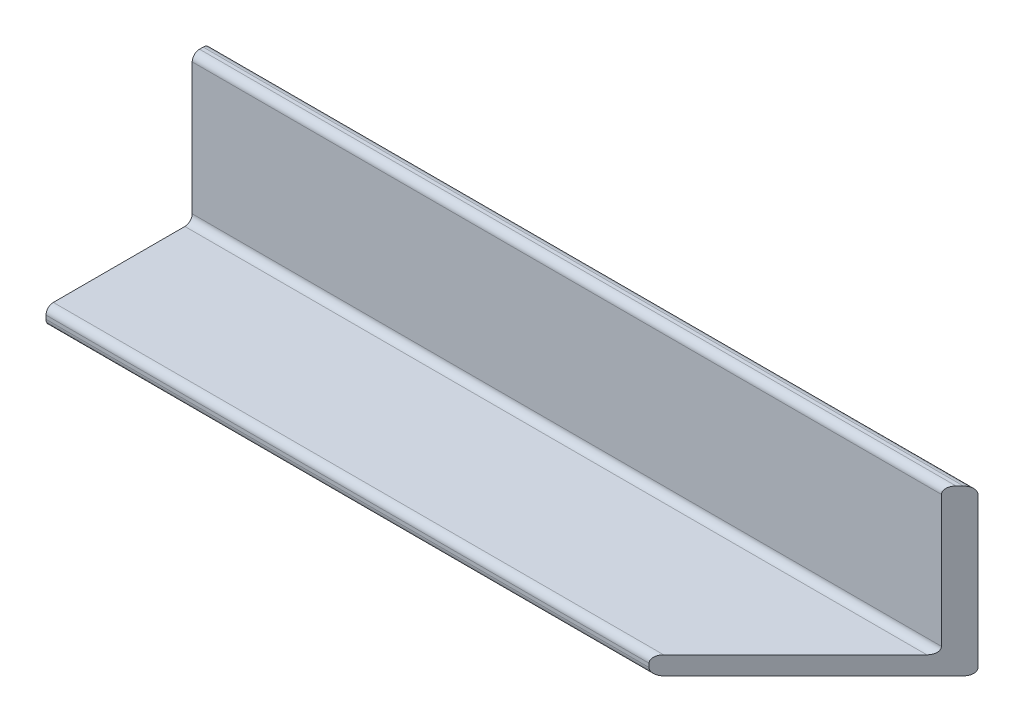
ISO-10303-21;
HEADER;
FILE_DESCRIPTION(('STEP AP214'),'2;1');
FILE_NAME('part.step','',(''),(''),'','','');
FILE_SCHEMA(('AUTOMOTIVE_DESIGN { 1 0 10303 214 1 1 1 1 }'));
ENDSEC;
DATA;
#1=APPLICATION_CONTEXT('core data for automotive mechanical design processes');
#2=APPLICATION_PROTOCOL_DEFINITION('international standard','automotive_design',2000,#1);
#3=PRODUCT_CONTEXT('',#1,'mechanical');
#4=PRODUCT('Part','Part','',(#3));
#5=PRODUCT_RELATED_PRODUCT_CATEGORY('part','',(#4));
#6=PRODUCT_DEFINITION_FORMATION('','',#4);
#7=PRODUCT_DEFINITION_CONTEXT('part definition',#1,'design');
#8=PRODUCT_DEFINITION('design','',#6,#7);
#9=PRODUCT_DEFINITION_SHAPE('','',#8);
#10=(LENGTH_UNIT() NAMED_UNIT(*) SI_UNIT(.MILLI.,.METRE.));
#11=(NAMED_UNIT(*) PLANE_ANGLE_UNIT() SI_UNIT($,.RADIAN.));
#12=(NAMED_UNIT(*) SI_UNIT($,.STERADIAN.) SOLID_ANGLE_UNIT());
#13=UNCERTAINTY_MEASURE_WITH_UNIT(LENGTH_MEASURE(1.E-05),#10,'distance_accuracy_value','');
#14=(GEOMETRIC_REPRESENTATION_CONTEXT(3) GLOBAL_UNCERTAINTY_ASSIGNED_CONTEXT((#13)) GLOBAL_UNIT_ASSIGNED_CONTEXT((#10,
#11,#12)) REPRESENTATION_CONTEXT('',''));
#15=CARTESIAN_POINT('',(0.,0.,0.));
#16=DIRECTION('',(0.,0.,1.));
#17=DIRECTION('',(1.,0.,0.));
#18=AXIS2_PLACEMENT_3D('',#15,#16,#17);
#19=CARTESIAN_POINT('',(-52.5,2.5,-11.25));
#20=DIRECTION('',(0.,0.,1.));
#21=DIRECTION('',(1.,0.,0.));
#22=AXIS2_PLACEMENT_3D('',#19,#20,#21);
#23=PLANE('',#22);
#24=DIRECTION('',(0.,-1.,0.));
#25=VECTOR('',#24,1.);
#26=CARTESIAN_POINT('',(-52.5,2.5,-11.25));
#27=LINE('',#26,#25);
#28=CARTESIAN_POINT('',(-52.5,21.5,-11.25));
#29=VERTEX_POINT('',#28);
#30=CARTESIAN_POINT('',(-52.5,1.,-11.25));
#31=VERTEX_POINT('',#30);
#32=EDGE_CURVE('E215',#29,#31,#27,.T.);
#33=ORIENTED_EDGE('',*,*,#32,.F.);
#34=DIRECTION('',(-1.,0.,0.));
#35=VECTOR('',#34,1.);
#36=CARTESIAN_POINT('',(52.5,21.5,-11.25));
#37=LINE('',#36,#35);
#38=CARTESIAN_POINT('',(52.5,21.5,-11.25));
#39=VERTEX_POINT('',#38);
#40=EDGE_CURVE('E158',#29,#39,#37,.F.);
#41=ORIENTED_EDGE('',*,*,#40,.T.);
#42=DIRECTION('',(0.,-1.,0.));
#43=VECTOR('',#42,1.);
#44=CARTESIAN_POINT('',(52.5,2.5,-11.25));
#45=LINE('',#44,#43);
#46=CARTESIAN_POINT('',(52.5,1.,-11.25));
#47=VERTEX_POINT('',#46);
#48=EDGE_CURVE('E125',#39,#47,#45,.T.);
#49=ORIENTED_EDGE('',*,*,#48,.T.);
#50=DIRECTION('',(-1.,0.,0.));
#51=VECTOR('',#50,1.);
#52=CARTESIAN_POINT('',(-52.5,1.,-11.25));
#53=LINE('',#52,#51);
#54=EDGE_CURVE('E155',#47,#31,#53,.T.);
#55=ORIENTED_EDGE('',*,*,#54,.T.);
#56=EDGE_LOOP('',(#33,#41,#49,#55));
#57=FACE_BOUND('',#56,.T.);
#58=ADVANCED_FACE('F32',(#57),#23,.F.);
#59=CARTESIAN_POINT('',(-52.5,2.5,-11.25));
#60=DIRECTION('',(1.,0.,0.));
#61=DIRECTION('',(0.,0.,-1.));
#62=AXIS2_PLACEMENT_3D('',#59,#60,#61);
#63=PLANE('',#62);
#64=DIRECTION('',(0.,0.,1.));
#65=VECTOR('',#64,1.);
#66=CARTESIAN_POINT('',(-52.5,22.5,-11.25));
#67=LINE('',#66,#65);
#68=CARTESIAN_POINT('',(-52.5,22.5,-10.25));
#69=VERTEX_POINT('',#68);
#70=CARTESIAN_POINT('',(-52.5,22.5,-9.75));
#71=VERTEX_POINT('',#70);
#72=EDGE_CURVE('E192',#69,#71,#67,.T.);
#73=ORIENTED_EDGE('',*,*,#72,.F.);
#74=CARTESIAN_POINT('',(-52.5,21.5,-10.25));
#75=DIRECTION('',(1.,0.,0.));
#76=DIRECTION('',(0.,0.,-1.));
#77=AXIS2_PLACEMENT_3D('',#74,#75,#76);
#78=CIRCLE('',#77,1.);
#79=EDGE_CURVE('E142',#69,#29,#78,.F.);
#80=ORIENTED_EDGE('',*,*,#79,.T.);
#81=ORIENTED_EDGE('',*,*,#32,.T.);
#82=CARTESIAN_POINT('',(-52.5,1.,-10.25));
#83=DIRECTION('',(1.,0.,0.));
#84=DIRECTION('',(0.,0.,-1.));
#85=AXIS2_PLACEMENT_3D('',#82,#83,#84);
#86=CIRCLE('',#85,1.);
#87=CARTESIAN_POINT('',(-52.5,0.,-10.25));
#88=VERTEX_POINT('',#87);
#89=EDGE_CURVE('E143',#31,#88,#86,.F.);
#90=ORIENTED_EDGE('',*,*,#89,.T.);
#91=DIRECTION('',(0.,0.,1.));
#92=VECTOR('',#91,1.);
#93=CARTESIAN_POINT('',(-52.5,0.,-11.25));
#94=LINE('',#93,#92);
#95=CARTESIAN_POINT('',(-52.5,0.,10.25));
#96=VERTEX_POINT('',#95);
#97=EDGE_CURVE('E205',#88,#96,#94,.T.);
#98=ORIENTED_EDGE('',*,*,#97,.T.);
#99=CARTESIAN_POINT('',(-52.5,1.,10.25));
#100=DIRECTION('',(1.,0.,0.));
#101=DIRECTION('',(0.,0.,-1.));
#102=AXIS2_PLACEMENT_3D('',#99,#100,#101);
#103=CIRCLE('',#102,1.);
#104=CARTESIAN_POINT('',(-52.5,1.,11.25));
#105=VERTEX_POINT('',#104);
#106=EDGE_CURVE('E150',#96,#105,#103,.F.);
#107=ORIENTED_EDGE('',*,*,#106,.T.);
#108=DIRECTION('',(0.,-1.,0.));
#109=VECTOR('',#108,1.);
#110=CARTESIAN_POINT('',(-52.5,2.5,11.25));
#111=LINE('',#110,#109);
#112=CARTESIAN_POINT('',(-52.5,1.5,11.25));
#113=VERTEX_POINT('',#112);
#114=EDGE_CURVE('E211',#113,#105,#111,.T.);
#115=ORIENTED_EDGE('',*,*,#114,.F.);
#116=CARTESIAN_POINT('',(-52.5,1.5,10.25));
#117=DIRECTION('',(1.,0.,0.));
#118=DIRECTION('',(0.,0.,-1.));
#119=AXIS2_PLACEMENT_3D('',#116,#117,#118);
#120=CIRCLE('',#119,1.);
#121=CARTESIAN_POINT('',(-52.5,2.5,10.25));
#122=VERTEX_POINT('',#121);
#123=EDGE_CURVE('E145',#113,#122,#120,.F.);
#124=ORIENTED_EDGE('',*,*,#123,.T.);
#125=DIRECTION('',(0.,0.,1.));
#126=VECTOR('',#125,1.);
#127=CARTESIAN_POINT('',(-52.5,2.5,-11.25));
#128=LINE('',#127,#126);
#129=CARTESIAN_POINT('',(-52.5,2.5,-7.75));
#130=VERTEX_POINT('',#129);
#131=EDGE_CURVE('E201',#130,#122,#128,.T.);
#132=ORIENTED_EDGE('',*,*,#131,.F.);
#133=CARTESIAN_POINT('',(-52.5,3.5,-7.75));
#134=DIRECTION('',(1.,0.,0.));
#135=DIRECTION('',(0.,0.,-1.));
#136=AXIS2_PLACEMENT_3D('',#133,#134,#135);
#137=CIRCLE('',#136,1.);
#138=CARTESIAN_POINT('',(-52.5,3.5,-8.75));
#139=VERTEX_POINT('',#138);
#140=EDGE_CURVE('E11',#130,#139,#137,.T.);
#141=ORIENTED_EDGE('',*,*,#140,.T.);
#142=DIRECTION('',(0.,-1.,0.));
#143=VECTOR('',#142,1.);
#144=CARTESIAN_POINT('',(-52.5,22.5,-8.75));
#145=LINE('',#144,#143);
#146=CARTESIAN_POINT('',(-52.5,21.5,-8.75));
#147=VERTEX_POINT('',#146);
#148=EDGE_CURVE('E199',#147,#139,#145,.T.);
#149=ORIENTED_EDGE('',*,*,#148,.F.);
#150=CARTESIAN_POINT('',(-52.5,21.5,-9.75));
#151=DIRECTION('',(1.,0.,0.));
#152=DIRECTION('',(0.,0.,-1.));
#153=AXIS2_PLACEMENT_3D('',#150,#151,#152);
#154=CIRCLE('',#153,1.);
#155=EDGE_CURVE('E152',#147,#71,#154,.F.);
#156=ORIENTED_EDGE('',*,*,#155,.T.);
#157=EDGE_LOOP('',(#73,#80,#81,#90,#98,#107,#115,#124,#132,#141,#149,#156));
#158=FACE_BOUND('',#157,.T.);
#159=ADVANCED_FACE('F198',(#158),#63,.F.);
#160=CARTESIAN_POINT('',(-52.5,2.5,11.25));
#161=DIRECTION('',(0.,0.,-1.));
#162=DIRECTION('',(-1.,0.,0.));
#163=AXIS2_PLACEMENT_3D('',#160,#161,#162);
#164=PLANE('',#163);
#165=ORIENTED_EDGE('',*,*,#114,.T.);
#166=DIRECTION('',(1.,0.,0.));
#167=VECTOR('',#166,1.);
#168=CARTESIAN_POINT('',(-52.5,1.,11.25));
#169=LINE('',#168,#167);
#170=CARTESIAN_POINT('',(30.0000000000002,1.00000000000001,11.25));
#171=VERTEX_POINT('',#170);
#172=EDGE_CURVE('E172',#105,#171,#169,.T.);
#173=ORIENTED_EDGE('',*,*,#172,.T.);
#174=DIRECTION('',(0.,-1.,0.));
#175=VECTOR('',#174,1.);
#176=CARTESIAN_POINT('',(30.0000000000002,22.5,11.25));
#177=LINE('',#176,#175);
#178=CARTESIAN_POINT('',(30.0000000000002,1.50000000000001,11.25));
#179=VERTEX_POINT('',#178);
#180=EDGE_CURVE('E243',#179,#171,#177,.T.);
#181=ORIENTED_EDGE('',*,*,#180,.F.);
#182=DIRECTION('',(1.,0.,0.));
#183=VECTOR('',#182,1.);
#184=CARTESIAN_POINT('',(-52.5,1.5,11.25));
#185=LINE('',#184,#183);
#186=EDGE_CURVE('E170',#179,#113,#185,.F.);
#187=ORIENTED_EDGE('',*,*,#186,.T.);
#188=EDGE_LOOP('',(#165,#173,#181,#187));
#189=FACE_BOUND('',#188,.T.);
#190=ADVANCED_FACE('F239',(#189),#164,.F.);
#191=CARTESIAN_POINT('',(0.,2.5,0.));
#192=DIRECTION('',(0.,1.,0.));
#193=DIRECTION('',(0.,0.,1.));
#194=AXIS2_PLACEMENT_3D('',#191,#192,#193);
#195=PLANE('',#194);
#196=ORIENTED_EDGE('',*,*,#131,.T.);
#197=DIRECTION('',(1.,0.,0.));
#198=VECTOR('',#197,1.);
#199=CARTESIAN_POINT('',(30.0000000000002,2.5,10.25));
#200=LINE('',#199,#198);
#201=CARTESIAN_POINT('',(31.0000000000002,2.5,10.25));
#202=VERTEX_POINT('',#201);
#203=EDGE_CURVE('E181',#122,#202,#200,.T.);
#204=ORIENTED_EDGE('',*,*,#203,.T.);
#205=DIRECTION('',(-0.707106781186544,0.,0.707106781186551));
#206=VECTOR('',#205,1.);
#207=CARTESIAN_POINT('',(20.6250000000003,2.5,20.625));
#208=LINE('',#207,#206);
#209=CARTESIAN_POINT('',(49.,2.5,-7.75));
#210=VERTEX_POINT('',#209);
#211=EDGE_CURVE('E185',#210,#202,#208,.T.);
#212=ORIENTED_EDGE('',*,*,#211,.F.);
#213=DIRECTION('',(1.,0.,0.));
#214=VECTOR('',#213,1.);
#215=CARTESIAN_POINT('',(0.,2.5,-7.75));
#216=LINE('',#215,#214);
#217=EDGE_CURVE('E179',#210,#130,#216,.F.);
#218=ORIENTED_EDGE('',*,*,#217,.T.);
#219=EDGE_LOOP('',(#196,#204,#212,#218));
#220=FACE_BOUND('',#219,.T.);
#221=ADVANCED_FACE('F189',(#220),#195,.T.);
#222=CARTESIAN_POINT('',(0.,0.,0.));
#223=DIRECTION('',(0.,1.,0.));
#224=DIRECTION('',(0.,0.,1.));
#225=AXIS2_PLACEMENT_3D('',#222,#223,#224);
#226=PLANE('',#225);
#227=DIRECTION('',(0.707106781186544,0.,-0.707106781186551));
#228=VECTOR('',#227,1.);
#229=CARTESIAN_POINT('',(52.5,0.,-11.25));
#230=LINE('',#229,#228);
#231=CARTESIAN_POINT('',(31.0000000000002,0.,10.25));
#232=VERTEX_POINT('',#231);
#233=CARTESIAN_POINT('',(51.5,0.,-10.25));
#234=VERTEX_POINT('',#233);
#235=EDGE_CURVE('E232',#232,#234,#230,.T.);
#236=ORIENTED_EDGE('',*,*,#235,.F.);
#237=DIRECTION('',(1.,0.,0.));
#238=VECTOR('',#237,1.);
#239=CARTESIAN_POINT('',(0.,0.,10.25));
#240=LINE('',#239,#238);
#241=EDGE_CURVE('E177',#232,#96,#240,.F.);
#242=ORIENTED_EDGE('',*,*,#241,.T.);
#243=ORIENTED_EDGE('',*,*,#97,.F.);
#244=DIRECTION('',(-1.,0.,0.));
#245=VECTOR('',#244,1.);
#246=CARTESIAN_POINT('',(0.,0.,-10.25));
#247=LINE('',#246,#245);
#248=EDGE_CURVE('E175',#88,#234,#247,.F.);
#249=ORIENTED_EDGE('',*,*,#248,.T.);
#250=EDGE_LOOP('',(#236,#242,#243,#249));
#251=FACE_BOUND('',#250,.T.);
#252=ADVANCED_FACE('F229',(#251),#226,.F.);
#253=CARTESIAN_POINT('',(-52.5,22.5,-8.75));
#254=DIRECTION('',(0.,0.,-1.));
#255=DIRECTION('',(-1.,0.,0.));
#256=AXIS2_PLACEMENT_3D('',#253,#254,#255);
#257=PLANE('',#256);
#258=DIRECTION('',(0.,1.,0.));
#259=VECTOR('',#258,1.);
#260=CARTESIAN_POINT('',(50.,22.5,-8.75));
#261=LINE('',#260,#259);
#262=CARTESIAN_POINT('',(50.,3.5,-8.75));
#263=VERTEX_POINT('',#262);
#264=CARTESIAN_POINT('',(50.,21.5,-8.75));
#265=VERTEX_POINT('',#264);
#266=EDGE_CURVE('E186',#263,#265,#261,.T.);
#267=ORIENTED_EDGE('',*,*,#266,.T.);
#268=DIRECTION('',(1.,0.,0.));
#269=VECTOR('',#268,1.);
#270=CARTESIAN_POINT('',(-52.5,21.5,-8.75));
#271=LINE('',#270,#269);
#272=EDGE_CURVE('E168',#265,#147,#271,.F.);
#273=ORIENTED_EDGE('',*,*,#272,.T.);
#274=ORIENTED_EDGE('',*,*,#148,.T.);
#275=DIRECTION('',(1.,0.,0.));
#276=VECTOR('',#275,1.);
#277=CARTESIAN_POINT('',(-52.5,3.5,-8.75));
#278=LINE('',#277,#276);
#279=EDGE_CURVE('E129',#139,#263,#278,.T.);
#280=ORIENTED_EDGE('',*,*,#279,.T.);
#281=EDGE_LOOP('',(#267,#273,#274,#280));
#282=FACE_BOUND('',#281,.T.);
#283=ADVANCED_FACE('F203',(#282),#257,.F.);
#284=CARTESIAN_POINT('',(0.,22.5,0.));
#285=DIRECTION('',(0.,1.,0.));
#286=DIRECTION('',(0.,0.,1.));
#287=AXIS2_PLACEMENT_3D('',#284,#285,#286);
#288=PLANE('',#287);
#289=DIRECTION('',(-0.707106781186544,0.,0.707106781186551));
#290=VECTOR('',#289,1.);
#291=CARTESIAN_POINT('',(20.6250000000003,22.5,20.625));
#292=LINE('',#291,#290);
#293=CARTESIAN_POINT('',(51.5,22.5,-10.25));
#294=VERTEX_POINT('',#293);
#295=CARTESIAN_POINT('',(51.,22.5,-9.75));
#296=VERTEX_POINT('',#295);
#297=EDGE_CURVE('E123',#294,#296,#292,.T.);
#298=ORIENTED_EDGE('',*,*,#297,.F.);
#299=DIRECTION('',(-1.,0.,0.));
#300=VECTOR('',#299,1.);
#301=CARTESIAN_POINT('',(-52.5,22.5,-10.25));
#302=LINE('',#301,#300);
#303=EDGE_CURVE('E136',#294,#69,#302,.T.);
#304=ORIENTED_EDGE('',*,*,#303,.T.);
#305=ORIENTED_EDGE('',*,*,#72,.T.);
#306=DIRECTION('',(1.,0.,0.));
#307=VECTOR('',#306,1.);
#308=CARTESIAN_POINT('',(50.,22.5,-9.75));
#309=LINE('',#308,#307);
#310=EDGE_CURVE('E139',#71,#296,#309,.T.);
#311=ORIENTED_EDGE('',*,*,#310,.T.);
#312=EDGE_LOOP('',(#298,#304,#305,#311));
#313=FACE_BOUND('',#312,.T.);
#314=ADVANCED_FACE('F134',(#313),#288,.T.);
#315=CARTESIAN_POINT('',(52.5,22.5,-11.25));
#316=DIRECTION('',(-0.707106781186551,0.,-0.707106781186544));
#317=DIRECTION('',(-0.707106781186544,0.,0.707106781186551));
#318=AXIS2_PLACEMENT_3D('',#315,#316,#317);
#319=PLANE('',#318);
#320=ORIENTED_EDGE('',*,*,#48,.F.);
#321=CARTESIAN_POINT('',(51.5,21.5,-10.25));
#322=DIRECTION('',(-0.707106781186551,0.,-0.707106781186544));
#323=DIRECTION('',(0.707106781186544,0.,-0.707106781186551));
#324=AXIS2_PLACEMENT_3D('',#321,#322,#323);
#325=ELLIPSE('',#324,1.41421356237309,1.);
#326=EDGE_CURVE('E120',#39,#294,#325,.F.);
#327=ORIENTED_EDGE('',*,*,#326,.T.);
#328=ORIENTED_EDGE('',*,*,#297,.T.);
#329=CARTESIAN_POINT('',(51.,21.5,-9.75));
#330=DIRECTION('',(-0.707106781186551,0.,-0.707106781186544));
#331=DIRECTION('',(-0.707106781186544,0.,0.707106781186551));
#332=AXIS2_PLACEMENT_3D('',#329,#330,#331);
#333=ELLIPSE('',#332,1.41421356237309,1.);
#334=EDGE_CURVE('E47',#296,#265,#333,.F.);
#335=ORIENTED_EDGE('',*,*,#334,.T.);
#336=ORIENTED_EDGE('',*,*,#266,.F.);
#337=CARTESIAN_POINT('',(49.,3.5,-7.75));
#338=DIRECTION('',(-0.707106781186551,0.,-0.707106781186544));
#339=DIRECTION('',(0.707106781186544,0.,-0.707106781186551));
#340=AXIS2_PLACEMENT_3D('',#337,#338,#339);
#341=ELLIPSE('',#340,1.41421356237309,1.);
#342=EDGE_CURVE('E40',#263,#210,#341,.T.);
#343=ORIENTED_EDGE('',*,*,#342,.T.);
#344=ORIENTED_EDGE('',*,*,#211,.T.);
#345=CARTESIAN_POINT('',(31.0000000000002,1.5,10.25));
#346=DIRECTION('',(-0.707106781186551,0.,-0.707106781186544));
#347=DIRECTION('',(-0.707106781186544,0.,0.707106781186551));
#348=AXIS2_PLACEMENT_3D('',#345,#346,#347);
#349=ELLIPSE('',#348,1.41421356237309,1.);
#350=EDGE_CURVE('E162',#202,#179,#349,.F.);
#351=ORIENTED_EDGE('',*,*,#350,.T.);
#352=ORIENTED_EDGE('',*,*,#180,.T.);
#353=CARTESIAN_POINT('',(31.0000000000002,1.,10.25));
#354=DIRECTION('',(-0.707106781186551,0.,-0.707106781186544));
#355=DIRECTION('',(0.707106781186544,0.,-0.707106781186551));
#356=AXIS2_PLACEMENT_3D('',#353,#354,#355);
#357=ELLIPSE('',#356,1.41421356237309,1.);
#358=EDGE_CURVE('E164',#171,#232,#357,.F.);
#359=ORIENTED_EDGE('',*,*,#358,.T.);
#360=ORIENTED_EDGE('',*,*,#235,.T.);
#361=CARTESIAN_POINT('',(51.5,1.,-10.25));
#362=DIRECTION('',(-0.707106781186551,0.,-0.707106781186544));
#363=DIRECTION('',(-0.707106781186544,0.,0.707106781186551));
#364=AXIS2_PLACEMENT_3D('',#361,#362,#363);
#365=ELLIPSE('',#364,1.41421356237309,1.);
#366=EDGE_CURVE('E160',#234,#47,#365,.F.);
#367=ORIENTED_EDGE('',*,*,#366,.T.);
#368=EDGE_LOOP('',(#320,#327,#328,#335,#336,#343,#344,#351,#352,#359,#360,#367));
#369=FACE_BOUND('',#368,.T.);
#370=ADVANCED_FACE('F122',(#369),#319,.F.);
#371=CARTESIAN_POINT('',(0.,21.5,-10.25));
#372=DIRECTION('',(1.,0.,0.));
#373=DIRECTION('',(0.,0.,-1.));
#374=AXIS2_PLACEMENT_3D('',#371,#372,#373);
#375=CYLINDRICAL_SURFACE('',#374,1.);
#376=ORIENTED_EDGE('',*,*,#326,.F.);
#377=ORIENTED_EDGE('',*,*,#40,.F.);
#378=ORIENTED_EDGE('',*,*,#79,.F.);
#379=ORIENTED_EDGE('',*,*,#303,.F.);
#380=EDGE_LOOP('',(#376,#377,#378,#379));
#381=FACE_BOUND('',#380,.T.);
#382=ADVANCED_FACE('F141',(#381),#375,.T.);
#383=CARTESIAN_POINT('',(0.,21.5,-9.75));
#384=DIRECTION('',(-1.,0.,0.));
#385=DIRECTION('',(0.,0.,1.));
#386=AXIS2_PLACEMENT_3D('',#383,#384,#385);
#387=CYLINDRICAL_SURFACE('',#386,1.);
#388=ORIENTED_EDGE('',*,*,#155,.F.);
#389=ORIENTED_EDGE('',*,*,#272,.F.);
#390=ORIENTED_EDGE('',*,*,#334,.F.);
#391=ORIENTED_EDGE('',*,*,#310,.F.);
#392=EDGE_LOOP('',(#388,#389,#390,#391));
#393=FACE_BOUND('',#392,.T.);
#394=ADVANCED_FACE('F250',(#393),#387,.T.);
#395=CARTESIAN_POINT('',(-52.5,1.,10.25));
#396=DIRECTION('',(1.,0.,0.));
#397=DIRECTION('',(0.,0.,-1.));
#398=AXIS2_PLACEMENT_3D('',#395,#396,#397);
#399=CYLINDRICAL_SURFACE('',#398,1.);
#400=ORIENTED_EDGE('',*,*,#106,.F.);
#401=ORIENTED_EDGE('',*,*,#241,.F.);
#402=ORIENTED_EDGE('',*,*,#358,.F.);
#403=ORIENTED_EDGE('',*,*,#172,.F.);
#404=EDGE_LOOP('',(#400,#401,#402,#403));
#405=FACE_BOUND('',#404,.T.);
#406=ADVANCED_FACE('F234',(#405),#399,.T.);
#407=CARTESIAN_POINT('',(0.,1.5,10.25));
#408=DIRECTION('',(-1.,0.,0.));
#409=DIRECTION('',(0.,0.,1.));
#410=AXIS2_PLACEMENT_3D('',#407,#408,#409);
#411=CYLINDRICAL_SURFACE('',#410,1.);
#412=ORIENTED_EDGE('',*,*,#123,.F.);
#413=ORIENTED_EDGE('',*,*,#186,.F.);
#414=ORIENTED_EDGE('',*,*,#350,.F.);
#415=ORIENTED_EDGE('',*,*,#203,.F.);
#416=EDGE_LOOP('',(#412,#413,#414,#415));
#417=FACE_BOUND('',#416,.T.);
#418=ADVANCED_FACE('F245',(#417),#411,.T.);
#419=CARTESIAN_POINT('',(-52.5,1.,-10.25));
#420=DIRECTION('',(-1.,0.,0.));
#421=DIRECTION('',(0.,0.,1.));
#422=AXIS2_PLACEMENT_3D('',#419,#420,#421);
#423=CYLINDRICAL_SURFACE('',#422,1.);
#424=ORIENTED_EDGE('',*,*,#366,.F.);
#425=ORIENTED_EDGE('',*,*,#248,.F.);
#426=ORIENTED_EDGE('',*,*,#89,.F.);
#427=ORIENTED_EDGE('',*,*,#54,.F.);
#428=EDGE_LOOP('',(#424,#425,#426,#427));
#429=FACE_BOUND('',#428,.T.);
#430=ADVANCED_FACE('F223',(#429),#423,.T.);
#431=CARTESIAN_POINT('',(-52.5,3.5,-7.75));
#432=DIRECTION('',(1.,0.,0.));
#433=DIRECTION('',(0.,0.,-1.));
#434=AXIS2_PLACEMENT_3D('',#431,#432,#433);
#435=CYLINDRICAL_SURFACE('',#434,1.);
#436=ORIENTED_EDGE('',*,*,#140,.F.);
#437=ORIENTED_EDGE('',*,*,#217,.F.);
#438=ORIENTED_EDGE('',*,*,#342,.F.);
#439=ORIENTED_EDGE('',*,*,#279,.F.);
#440=EDGE_LOOP('',(#436,#437,#438,#439));
#441=FACE_BOUND('',#440,.T.);
#442=ADVANCED_FACE('F34',(#441),#435,.F.);
#443=CLOSED_SHELL('',(#58,#159,#190,#221,#252,#283,#314,#370,#382,#394,#406,#418,#430,#442));
#444=MANIFOLD_SOLID_BREP('B2',#443);
#445=ADVANCED_BREP_SHAPE_REPRESENTATION('',(#18,#444),#14);
#446=SHAPE_DEFINITION_REPRESENTATION(#9,#445);
ENDSEC;
END-ISO-10303-21;
